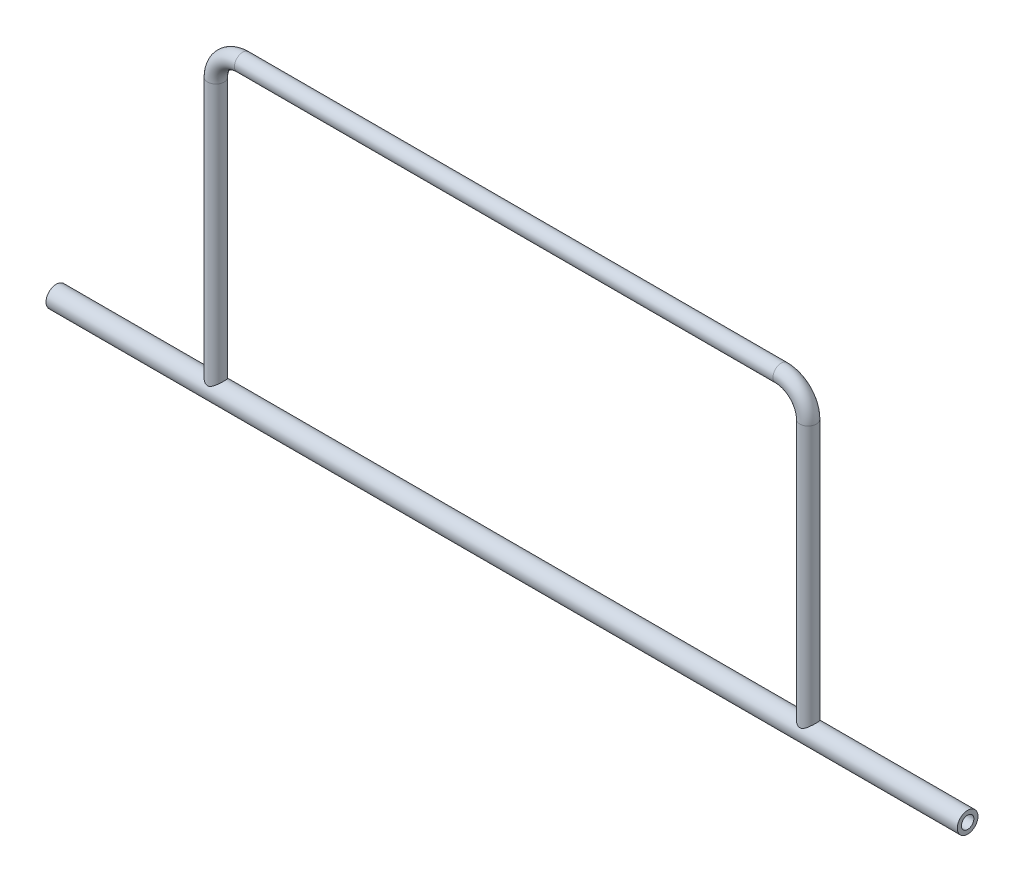
ISO-10303-21;
HEADER;
FILE_DESCRIPTION(('STEP AP214'),'2;1');
FILE_NAME('part.step','',(''),(''),'','','');
FILE_SCHEMA(('AUTOMOTIVE_DESIGN { 1 0 10303 214 1 1 1 1 }'));
ENDSEC;
DATA;
#1=APPLICATION_CONTEXT('core data for automotive mechanical design processes');
#2=APPLICATION_PROTOCOL_DEFINITION('international standard','automotive_design',2000,#1);
#3=PRODUCT_CONTEXT('',#1,'mechanical');
#4=PRODUCT('Part','Part','',(#3));
#5=PRODUCT_RELATED_PRODUCT_CATEGORY('part','',(#4));
#6=PRODUCT_DEFINITION_FORMATION('','',#4);
#7=PRODUCT_DEFINITION_CONTEXT('part definition',#1,'design');
#8=PRODUCT_DEFINITION('design','',#6,#7);
#9=PRODUCT_DEFINITION_SHAPE('','',#8);
#10=(LENGTH_UNIT() NAMED_UNIT(*) SI_UNIT(.MILLI.,.METRE.));
#11=(NAMED_UNIT(*) PLANE_ANGLE_UNIT() SI_UNIT($,.RADIAN.));
#12=(NAMED_UNIT(*) SI_UNIT($,.STERADIAN.) SOLID_ANGLE_UNIT());
#13=UNCERTAINTY_MEASURE_WITH_UNIT(LENGTH_MEASURE(1.E-05),#10,'distance_accuracy_value','');
#14=(GEOMETRIC_REPRESENTATION_CONTEXT(3) GLOBAL_UNCERTAINTY_ASSIGNED_CONTEXT((#13)) GLOBAL_UNIT_ASSIGNED_CONTEXT((#10,
#11,#12)) REPRESENTATION_CONTEXT('',''));
#15=CARTESIAN_POINT('',(0.,0.,0.));
#16=DIRECTION('',(0.,0.,1.));
#17=DIRECTION('',(1.,0.,0.));
#18=AXIS2_PLACEMENT_3D('',#15,#16,#17);
#19=CARTESIAN_POINT('',(-220.,0.,0.));
#20=DIRECTION('',(1.,0.,0.));
#21=DIRECTION('',(0.,0.,-1.));
#22=AXIS2_PLACEMENT_3D('',#19,#20,#21);
#23=CYLINDRICAL_SURFACE('',#22,5.);
#24=CARTESIAN_POINT('',(220.,0.,0.));
#25=DIRECTION('',(1.,0.,0.));
#26=DIRECTION('',(0.,0.,-1.));
#27=AXIS2_PLACEMENT_3D('',#24,#25,#26);
#28=CIRCLE('',#27,5.);
#29=CARTESIAN_POINT('',(220.,0.,-5.));
#30=VERTEX_POINT('',#29);
#31=EDGE_CURVE('E117',#30,#30,#28,.T.);
#32=ORIENTED_EDGE('',*,*,#31,.F.);
#33=EDGE_LOOP('',(#32));
#34=FACE_BOUND('',#33,.T.);
#35=CARTESIAN_POINT('',(-143.,3.,4.));
#36=CARTESIAN_POINT('',(-143.075112763872,3.00000216897706,3.99999906153736));
#37=CARTESIAN_POINT('',(-143.150254878305,3.0028377209995,3.9978772461753));
#38=CARTESIAN_POINT('',(-143.299908566862,3.01402583978567,3.9894472679785));
#39=CARTESIAN_POINT('',(-143.374419675909,3.02238216858029,3.98313625047582));
#40=CARTESIAN_POINT('',(-143.596479266939,3.05522921920832,3.95807727295162));
#41=CARTESIAN_POINT('',(-143.742244109025,3.0874955182953,3.93320424396427));
#42=CARTESIAN_POINT('',(-144.075267929606,3.18155216304267,3.85777127536566));
#43=CARTESIAN_POINT('',(-144.259280762929,3.24971322017134,3.80127986277753));
#44=CARTESIAN_POINT('',(-144.611940543659,3.40189644530756,3.66572012951489));
#45=CARTESIAN_POINT('',(-144.78054239204,3.48596308623153,3.58658817896458));
#46=CARTESIAN_POINT('',(-145.051102580511,3.63299455510024,3.4363727853443));
#47=CARTESIAN_POINT('',(-145.157172572942,3.694143683478,3.37076459378185));
#48=CARTESIAN_POINT('',(-145.362360914869,3.81759266309351,3.23028207033377));
#49=CARTESIAN_POINT('',(-145.461476749144,3.87989292049062,3.15540441260615));
#50=CARTESIAN_POINT('',(-145.652469855169,4.00378958470974,2.99663184861431));
#51=CARTESIAN_POINT('',(-145.744354519094,4.06538665380559,2.91274636380753));
#52=CARTESIAN_POINT('',(-145.920613018511,4.18639237889891,2.73598294461539));
#53=CARTESIAN_POINT('',(-146.00498586031,4.24580074475848,2.64310382389852));
#54=CARTESIAN_POINT('',(-146.214164134542,4.39576497816679,2.38958702931891));
#55=CARTESIAN_POINT('',(-146.332640399593,4.48348070331292,2.22188522507705));
#56=CARTESIAN_POINT('',(-146.54474406666,4.64331594269541,1.86487183658861));
#57=CARTESIAN_POINT('',(-146.638410083669,4.71545966061737,1.67559449748562));
#58=CARTESIAN_POINT('',(-146.783423416902,4.82831023596969,1.31063780833639));
#59=CARTESIAN_POINT('',(-146.839164458238,4.87221400973622,1.13770814774396));
#60=CARTESIAN_POINT('',(-146.926998061055,4.94171895740111,0.78237513014681));
#61=CARTESIAN_POINT('',(-146.959103555756,4.96733014065903,0.599977012805112));
#62=CARTESIAN_POINT('',(-146.997716006024,4.99815918603462,0.230096932996524));
#63=CARTESIAN_POINT('',(-147.004134337086,5.00330644418758,0.0425996130134163));
#64=CARTESIAN_POINT('',(-146.990671578549,4.99253877415278,-0.330832803126801));
#65=CARTESIAN_POINT('',(-146.970789271868,4.97662287125135,-0.516767826586752));
#66=CARTESIAN_POINT('',(-146.907864015456,4.92656730161909,-0.871367119528885));
#67=CARTESIAN_POINT('',(-146.866142362886,4.89346809374314,-1.04042037317328));
#68=CARTESIAN_POINT('',(-146.762609534698,4.81208987661317,-1.3683437290071));
#69=CARTESIAN_POINT('',(-146.700793289892,4.76380703714183,-1.52721124956011));
#70=CARTESIAN_POINT('',(-146.552798601851,4.6497244388944,-1.84705463504237));
#71=CARTESIAN_POINT('',(-146.464846967744,4.582685312925,-2.00675938549038));
#72=CARTESIAN_POINT('',(-146.270924281044,4.43788087321012,-2.30941782762206));
#73=CARTESIAN_POINT('',(-146.164943141211,4.36010955958914,-2.45236206600431));
#74=CARTESIAN_POINT('',(-145.913876262479,4.18107021951003,-2.74853042703121));
#75=CARTESIAN_POINT('',(-145.765232772259,4.07826288579635,-2.89780217491636));
#76=CARTESIAN_POINT('',(-145.44748819203,3.8698475585256,-3.17076769972647));
#77=CARTESIAN_POINT('',(-145.27836224005,3.76423628533181,-3.29442988804259));
#78=CARTESIAN_POINT('',(-144.937559610716,3.56882635257452,-3.50457057042853));
#79=CARTESIAN_POINT('',(-144.767698127378,3.47848449125888,-3.59348348213152));
#80=CARTESIAN_POINT('',(-144.411267058945,3.311642115282,-3.74778213755155));
#81=CARTESIAN_POINT('',(-144.224735128158,3.23511152965086,-3.81321930924473));
#82=CARTESIAN_POINT('',(-143.894416813681,3.12787610334288,-3.9012440004466));
#83=CARTESIAN_POINT('',(-143.754774407918,3.09031204063763,-3.93080589266452));
#84=CARTESIAN_POINT('',(-143.469639518534,3.03334609209688,-3.97493954411983));
#85=CARTESIAN_POINT('',(-143.324160835899,3.01390372218814,-3.98954472407251));
#86=CARTESIAN_POINT('',(-143.030273501902,2.99655581152985,-4.00259995644497));
#87=CARTESIAN_POINT('',(-142.881852793524,2.99877509004065,-4.00095637919488));
#88=CARTESIAN_POINT('',(-142.587904384925,3.0246091025562,-3.98145195095297));
#89=CARTESIAN_POINT('',(-142.442381062989,3.04825402601149,-3.96356821696024));
#90=CARTESIAN_POINT('',(-142.121878115775,3.12103026774742,-3.90662980025043));
#91=CARTESIAN_POINT('',(-141.94882232993,3.1751148433933,-3.863346828879));
#92=CARTESIAN_POINT('',(-141.615399345019,3.30045577188713,-3.75682278303048));
#93=CARTESIAN_POINT('',(-141.455071781662,3.37176316858112,-3.69352220593003));
#94=CARTESIAN_POINT('',(-141.189074477891,3.50285579501051,-3.56873529200271));
#95=CARTESIAN_POINT('',(-141.080354696356,3.56053707787217,-3.51139365352878));
#96=CARTESIAN_POINT('',(-140.869582620207,3.67845509899158,-3.38766369294496));
#97=CARTESIAN_POINT('',(-140.767533088952,3.7386928795264,-3.32127165613198));
#98=CARTESIAN_POINT('',(-140.570043881248,3.85987201944703,-3.17963685728907));
#99=CARTESIAN_POINT('',(-140.474610822119,3.92081401406671,-3.10438543197552));
#100=CARTESIAN_POINT('',(-140.2906527842,4.04175247615811,-2.94520421443705));
#101=CARTESIAN_POINT('',(-140.202126727445,4.10174909000277,-2.86127578119152));
#102=CARTESIAN_POINT('',(-140.031149060477,4.22021627080505,-2.68353213742294));
#103=CARTESIAN_POINT('',(-139.948802776614,4.27865261127789,-2.58959239644204));
#104=CARTESIAN_POINT('',(-139.792257205107,4.39166054074386,-2.39294409088252));
#105=CARTESIAN_POINT('',(-139.718059192468,4.44623152443024,-2.29023415844015));
#106=CARTESIAN_POINT('',(-139.578894979503,4.54992450745381,-2.07659269983663));
#107=CARTESIAN_POINT('',(-139.513903972703,4.59906106720033,-1.96568453999986));
#108=CARTESIAN_POINT('',(-139.394017175426,4.6905881423898,-1.73599312724418));
#109=CARTESIAN_POINT('',(-139.339115669097,4.73298247555987,-1.61721438534427));
#110=CARTESIAN_POINT('',(-139.223065833842,4.82322056507459,-1.32913962146255));
#111=CARTESIAN_POINT('',(-139.166577838741,4.86768700006944,-1.15683679137337));
#112=CARTESIAN_POINT('',(-139.077123147012,4.93844243001733,-0.8027105168352));
#113=CARTESIAN_POINT('',(-139.044138494829,4.96474530068644,-0.620894454329545));
#114=CARTESIAN_POINT('',(-139.003617740141,4.99709091896648,-0.251928169863176));
#115=CARTESIAN_POINT('',(-138.996174493275,5.00305974169112,-0.064760973992973));
#116=CARTESIAN_POINT('',(-139.007532115076,4.99397521901684,0.308260451752421));
#117=CARTESIAN_POINT('',(-139.026334831698,4.97892039336181,0.494114588250236));
#118=CARTESIAN_POINT('',(-139.08720730726,4.93047997807309,0.848969594728834));
#119=CARTESIAN_POINT('',(-139.127978682933,4.89811800019638,1.01834018003767));
#120=CARTESIAN_POINT('',(-139.229706822495,4.81810404518645,1.34704122291862));
#121=CARTESIAN_POINT('',(-139.290668814301,4.77044810811757,1.50636906741204));
#122=CARTESIAN_POINT('',(-139.436748943794,4.65772424604642,1.8267669860776));
#123=CARTESIAN_POINT('',(-139.523587053218,4.59144870858765,1.98661951413855));
#124=CARTESIAN_POINT('',(-139.715285305531,4.44806715123529,2.28972858505144));
#125=CARTESIAN_POINT('',(-139.820155017026,4.37095538500456,2.43297624848932));
#126=CARTESIAN_POINT('',(-140.068589557793,4.19334053560391,2.72976152486732));
#127=CARTESIAN_POINT('',(-140.215681095874,4.09128024292154,2.87940400752529));
#128=CARTESIAN_POINT('',(-140.530245595292,3.88401197785617,3.15339914395298));
#129=CARTESIAN_POINT('',(-140.697743788482,3.77880023252427,3.27771997097513));
#130=CARTESIAN_POINT('',(-140.956465363112,3.62927982065265,3.43993958125248));
#131=CARTESIAN_POINT('',(-141.040019970102,3.58277064491089,3.48824759185102));
#132=CARTESIAN_POINT('',(-141.211352590074,3.49198784457613,3.57912761543909));
#133=CARTESIAN_POINT('',(-141.299131165734,3.44771451944072,3.62169886134501));
#134=CARTESIAN_POINT('',(-141.56867868407,3.32016981870035,3.74029659813687));
#135=CARTESIAN_POINT('',(-141.757075167135,3.24192092894642,3.80747088284748));
#136=CARTESIAN_POINT('',(-142.092338061681,3.13160451168611,3.89828691275498));
#137=CARTESIAN_POINT('',(-142.23498946695,3.09272315846935,3.92892882070588));
#138=CARTESIAN_POINT('',(-142.453408326191,3.04855095693215,3.96316402261263));
#139=CARTESIAN_POINT('',(-142.52685989967,3.03619187391989,3.97261660358216));
#140=CARTESIAN_POINT('',(-142.674838471096,3.01668227593598,3.98745340408319));
#141=CARTESIAN_POINT('',(-142.749364678678,3.00952811408349,3.99284047225642));
#142=CARTESIAN_POINT('',(-142.853381820678,3.00343793345697,3.99741959341137));
#143=CARTESIAN_POINT('',(-142.882678806619,3.00215019354812,3.99838660813179));
#144=CARTESIAN_POINT('',(-142.941315698446,3.00043074741308,3.99967703663994));
#145=CARTESIAN_POINT('',(-142.970655609424,2.99999915264321,4.00000036663029));
#146=CARTESIAN_POINT('',(-143.,3.,4.));
#147=B_SPLINE_CURVE_WITH_KNOTS('',3,(#35,#36,#37,#38,#39,#40,#41,#42,#43,#44,#45,#46,#47,#48,
#49,#50,#51,#52,#53,#54,#55,#56,#57,#58,#59,#60,#61,#62,#63,#64,#65,#66,#67,#68,#69,#70,#71,#72,
#73,#74,#75,#76,#77,#78,#79,#80,#81,#82,#83,#84,#85,#86,#87,#88,#89,#90,#91,#92,#93,#94,#95,#96,
#97,#98,#99,#100,#101,#102,#103,#104,#105,#106,#107,#108,#109,#110,#111,#112,#113,#114,#115,
#116,#117,#118,#119,#120,#121,#122,#123,#124,#125,#126,#127,#128,#129,#130,#131,#132,#133,#134,
#135,#136,#137,#138,#139,#140,#141,#142,#143,#144,#145,#146),.UNSPECIFIED.,.T.,.F.,(4,2,2,2,2,2,
2,2,2,2,2,2,2,2,2,2,2,2,2,2,2,2,2,2,2,2,2,2,2,2,2,2,2,2,2,2,2,2,2,2,2,2,2,2,2,2,2,2,2,2,2,2,2,2,
2,4),(0.,0.225303149807227,0.45075998683823,0.902589537001534,1.51190711853315,2.12295426111055,
2.53921883623533,2.95563320042539,3.37161619465104,3.78765413525728,4.45477512810168,
5.12085162154029,5.67923095322339,6.23730451573864,6.79730186307843,7.35732512562408,
7.88682741454584,8.4164633828124,8.99711927828842,9.57810111704289,10.2788135954479,
10.9803852999411,11.6143729322192,12.2469630912607,12.6881435902171,13.1283361077291,
13.5710666035102,14.0144218930567,14.5705602720658,15.1283675704705,15.5352238321968,
15.9422475922461,16.3496727250839,16.7570341440245,17.1702378198689,17.5835060601355,
17.9956387441516,18.4075372242806,18.9651425713466,19.5223214735685,20.0815238628588,
20.6407656270704,21.1700928587456,21.6995572553744,22.2782911959238,22.8573331992423,
23.5548944002192,24.2533270266165,24.5745079263912,24.8957317299052,25.5365329660935,
25.9876445768306,26.2126360623764,26.4374697531347,26.5254777394983,26.6134971823349),.UNSPECIFIED.);
#148=CARTESIAN_POINT('',(-143.,3.,4.));
#149=VERTEX_POINT('',#148);
#150=EDGE_CURVE('E75',#149,#149,#147,.T.);
#151=ORIENTED_EDGE('',*,*,#150,.T.);
#152=EDGE_LOOP('',(#151));
#153=FACE_BOUND('',#152,.T.);
#154=CARTESIAN_POINT('',(-220.,0.,0.));
#155=DIRECTION('',(1.,0.,0.));
#156=DIRECTION('',(0.,0.,-1.));
#157=AXIS2_PLACEMENT_3D('',#154,#155,#156);
#158=CIRCLE('',#157,5.);
#159=CARTESIAN_POINT('',(-220.,0.,-5.));
#160=VERTEX_POINT('',#159);
#161=EDGE_CURVE('E11',#160,#160,#158,.T.);
#162=ORIENTED_EDGE('',*,*,#161,.T.);
#163=EDGE_LOOP('',(#162));
#164=FACE_BOUND('',#163,.T.);
#165=CARTESIAN_POINT('',(143.,3.,4.));
#166=CARTESIAN_POINT('',(142.924887236128,3.00000216897706,3.99999906153736));
#167=CARTESIAN_POINT('',(142.849745121695,3.0028377209995,3.9978772461753));
#168=CARTESIAN_POINT('',(142.700091433138,3.01402583978567,3.9894472679785));
#169=CARTESIAN_POINT('',(142.625580324091,3.02238216858029,3.98313625047582));
#170=CARTESIAN_POINT('',(142.403520733061,3.05522921920832,3.95807727295162));
#171=CARTESIAN_POINT('',(142.257755890975,3.0874955182953,3.93320424396427));
#172=CARTESIAN_POINT('',(141.924732070394,3.18155216304267,3.85777127536566));
#173=CARTESIAN_POINT('',(141.740719237071,3.24971322017134,3.80127986277753));
#174=CARTESIAN_POINT('',(141.388059456341,3.40189644530756,3.66572012951489));
#175=CARTESIAN_POINT('',(141.21945760796,3.48596308623153,3.58658817896458));
#176=CARTESIAN_POINT('',(140.948897419489,3.63299455510026,3.43637278534428));
#177=CARTESIAN_POINT('',(140.842827427058,3.69414368347802,3.37076459378183));
#178=CARTESIAN_POINT('',(140.637639085131,3.81759266309354,3.23028207033374));
#179=CARTESIAN_POINT('',(140.538523250856,3.87989292049064,3.15540441260614));
#180=CARTESIAN_POINT('',(140.347530144831,4.00378958470974,2.99663184861431));
#181=CARTESIAN_POINT('',(140.255645480906,4.06538665380559,2.91274636380754));
#182=CARTESIAN_POINT('',(140.079386981489,4.18639237889891,2.7359829446154));
#183=CARTESIAN_POINT('',(139.99501413969,4.24580074475848,2.64310382389852));
#184=CARTESIAN_POINT('',(139.785835865458,4.39576497816679,2.3895870293189));
#185=CARTESIAN_POINT('',(139.667359600407,4.48348070331292,2.22188522507705));
#186=CARTESIAN_POINT('',(139.45525593334,4.64331594269541,1.86487183658861));
#187=CARTESIAN_POINT('',(139.361589916331,4.71545966061737,1.67559449748562));
#188=CARTESIAN_POINT('',(139.216576583098,4.82831023596969,1.31063780833639));
#189=CARTESIAN_POINT('',(139.160835541762,4.87221400973622,1.13770814774396));
#190=CARTESIAN_POINT('',(139.073001938945,4.94171895740111,0.78237513014681));
#191=CARTESIAN_POINT('',(139.040896444244,4.96733014065903,0.599977012805112));
#192=CARTESIAN_POINT('',(139.002283993976,4.99815918603462,0.230096932996524));
#193=CARTESIAN_POINT('',(138.995865662914,5.00330644418758,0.0425996130134156));
#194=CARTESIAN_POINT('',(139.009328421451,4.99253877415278,-0.330832803126801));
#195=CARTESIAN_POINT('',(139.029210728132,4.97662287125135,-0.516767826586753));
#196=CARTESIAN_POINT('',(139.092135984544,4.92656730161909,-0.871367119528885));
#197=CARTESIAN_POINT('',(139.133857637114,4.89346809374314,-1.04042037317328));
#198=CARTESIAN_POINT('',(139.237390465302,4.81208987661317,-1.3683437290071));
#199=CARTESIAN_POINT('',(139.299206710108,4.76380703714183,-1.52721124956011));
#200=CARTESIAN_POINT('',(139.447201398149,4.6497244388944,-1.84705463504237));
#201=CARTESIAN_POINT('',(139.535153032257,4.582685312925,-2.00675938549038));
#202=CARTESIAN_POINT('',(139.729075718956,4.43788087321012,-2.30941782762206));
#203=CARTESIAN_POINT('',(139.835056858789,4.36010955958914,-2.45236206600431));
#204=CARTESIAN_POINT('',(140.086123737521,4.18107021951003,-2.74853042703121));
#205=CARTESIAN_POINT('',(140.234767227741,4.07826288579635,-2.89780217491636));
#206=CARTESIAN_POINT('',(140.55251180797,3.8698475585256,-3.17076769972647));
#207=CARTESIAN_POINT('',(140.72163775995,3.76423628533181,-3.29442988804259));
#208=CARTESIAN_POINT('',(141.062440389284,3.56882635257452,-3.50457057042853));
#209=CARTESIAN_POINT('',(141.232301872622,3.47848449125888,-3.59348348213152));
#210=CARTESIAN_POINT('',(141.588732941055,3.311642115282,-3.74778213755155));
#211=CARTESIAN_POINT('',(141.775264871842,3.23511152965086,-3.81321930924473));
#212=CARTESIAN_POINT('',(142.105583186319,3.12787610334288,-3.9012440004466));
#213=CARTESIAN_POINT('',(142.245225592082,3.09031204063763,-3.93080589266452));
#214=CARTESIAN_POINT('',(142.530360481466,3.03334609209688,-3.97493954411983));
#215=CARTESIAN_POINT('',(142.675839164101,3.01390372218814,-3.98954472407251));
#216=CARTESIAN_POINT('',(142.969726498098,2.99655581152985,-4.00259995644497));
#217=CARTESIAN_POINT('',(143.118147206476,2.99877509004065,-4.00095637919488));
#218=CARTESIAN_POINT('',(143.412095615075,3.0246091025562,-3.98145195095297));
#219=CARTESIAN_POINT('',(143.557618937011,3.04825402601149,-3.96356821696024));
#220=CARTESIAN_POINT('',(143.878121884225,3.12103026774742,-3.90662980025043));
#221=CARTESIAN_POINT('',(144.05117767007,3.1751148433933,-3.863346828879));
#222=CARTESIAN_POINT('',(144.384600654981,3.30045577188713,-3.75682278303048));
#223=CARTESIAN_POINT('',(144.544928218338,3.37176316858112,-3.69352220593003));
#224=CARTESIAN_POINT('',(144.810925522109,3.50285579501052,-3.56873529200271));
#225=CARTESIAN_POINT('',(144.919645303644,3.56053707787218,-3.51139365352877));
#226=CARTESIAN_POINT('',(145.130417379793,3.6784550989916,-3.38766369294494));
#227=CARTESIAN_POINT('',(145.232466911048,3.73869287952641,-3.32127165613197));
#228=CARTESIAN_POINT('',(145.429956118752,3.85987201944704,-3.17963685728906));
#229=CARTESIAN_POINT('',(145.525389177881,3.92081401406672,-3.10438543197552));
#230=CARTESIAN_POINT('',(145.7093472158,4.04175247615812,-2.94520421443705));
#231=CARTESIAN_POINT('',(145.797873272555,4.10174909000277,-2.86127578119152));
#232=CARTESIAN_POINT('',(145.968850939523,4.22021627080505,-2.68353213742294));
#233=CARTESIAN_POINT('',(146.051197223386,4.27865261127789,-2.58959239644204));
#234=CARTESIAN_POINT('',(146.207742794893,4.39166054074386,-2.39294409088252));
#235=CARTESIAN_POINT('',(146.281940807532,4.44623152443024,-2.29023415844015));
#236=CARTESIAN_POINT('',(146.421105020497,4.54992450745381,-2.07659269983662));
#237=CARTESIAN_POINT('',(146.486096027297,4.59906106720033,-1.96568453999986));
#238=CARTESIAN_POINT('',(146.605982824574,4.6905881423898,-1.73599312724418));
#239=CARTESIAN_POINT('',(146.660884330903,4.73298247555987,-1.61721438534427));
#240=CARTESIAN_POINT('',(146.776934166158,4.82322056507459,-1.32913962146255));
#241=CARTESIAN_POINT('',(146.833422161259,4.86768700006944,-1.15683679137337));
#242=CARTESIAN_POINT('',(146.922876852988,4.93844243001733,-0.8027105168352));
#243=CARTESIAN_POINT('',(146.955861505171,4.96474530068644,-0.620894454329545));
#244=CARTESIAN_POINT('',(146.996382259859,4.99709091896648,-0.251928169863176));
#245=CARTESIAN_POINT('',(147.003825506725,5.00305974169112,-0.064760973992973));
#246=CARTESIAN_POINT('',(146.992467884924,4.99397521901684,0.308260451752421));
#247=CARTESIAN_POINT('',(146.973665168302,4.97892039336181,0.494114588250236));
#248=CARTESIAN_POINT('',(146.91279269274,4.93047997807309,0.848969594728834));
#249=CARTESIAN_POINT('',(146.872021317067,4.89811800019638,1.01834018003767));
#250=CARTESIAN_POINT('',(146.770293177505,4.81810404518645,1.34704122291862));
#251=CARTESIAN_POINT('',(146.709331185699,4.77044810811757,1.50636906741204));
#252=CARTESIAN_POINT('',(146.563251056206,4.65772424604642,1.8267669860776));
#253=CARTESIAN_POINT('',(146.476412946782,4.59144870858765,1.98661951413855));
#254=CARTESIAN_POINT('',(146.284714694469,4.44806715123529,2.28972858505144));
#255=CARTESIAN_POINT('',(146.179844982974,4.37095538500456,2.43297624848932));
#256=CARTESIAN_POINT('',(145.931410442207,4.19334053560392,2.72976152486731));
#257=CARTESIAN_POINT('',(145.784318904126,4.09128024292155,2.87940400752528));
#258=CARTESIAN_POINT('',(145.469754404708,3.88401197785618,3.15339914395297));
#259=CARTESIAN_POINT('',(145.302256211518,3.77880023252427,3.27771997097513));
#260=CARTESIAN_POINT('',(145.043534636888,3.62927982065265,3.43993958125248));
#261=CARTESIAN_POINT('',(144.959980029899,3.58277064491088,3.48824759185103));
#262=CARTESIAN_POINT('',(144.788647409926,3.49198784457612,3.57912761543911));
#263=CARTESIAN_POINT('',(144.700868834266,3.44771451944071,3.62169886134502));
#264=CARTESIAN_POINT('',(144.43132131593,3.32016981870035,3.74029659813687));
#265=CARTESIAN_POINT('',(144.242924832865,3.24192092894642,3.80747088284748));
#266=CARTESIAN_POINT('',(143.907661938319,3.13160451168611,3.89828691275498));
#267=CARTESIAN_POINT('',(143.76501053305,3.09272315846935,3.92892882070588));
#268=CARTESIAN_POINT('',(143.546591673809,3.04855095693215,3.96316402261263));
#269=CARTESIAN_POINT('',(143.47314010033,3.03619187391989,3.97261660358217));
#270=CARTESIAN_POINT('',(143.325161528904,3.01668227593598,3.98745340408319));
#271=CARTESIAN_POINT('',(143.250635321322,3.00952811408348,3.99284047225643));
#272=CARTESIAN_POINT('',(143.146618179322,3.00343793345697,3.99741959341137));
#273=CARTESIAN_POINT('',(143.117321193381,3.00215019354812,3.99838660813179));
#274=CARTESIAN_POINT('',(143.058684301554,3.00043074741308,3.99967703663994));
#275=CARTESIAN_POINT('',(143.029344390576,2.99999915264321,4.00000036663029));
#276=CARTESIAN_POINT('',(143.,3.,4.));
#277=B_SPLINE_CURVE_WITH_KNOTS('',3,(#165,#166,#167,#168,#169,#170,#171,#172,#173,#174,#175,
#176,#177,#178,#179,#180,#181,#182,#183,#184,#185,#186,#187,#188,#189,#190,#191,#192,#193,#194,
#195,#196,#197,#198,#199,#200,#201,#202,#203,#204,#205,#206,#207,#208,#209,#210,#211,#212,#213,
#214,#215,#216,#217,#218,#219,#220,#221,#222,#223,#224,#225,#226,#227,#228,#229,#230,#231,#232,
#233,#234,#235,#236,#237,#238,#239,#240,#241,#242,#243,#244,#245,#246,#247,#248,#249,#250,#251,
#252,#253,#254,#255,#256,#257,#258,#259,#260,#261,#262,#263,#264,#265,#266,#267,#268,#269,#270,
#271,#272,#273,#274,#275,#276),.UNSPECIFIED.,.T.,.F.,(4,2,2,2,2,2,2,2,2,2,2,2,2,2,2,2,2,2,2,2,2,
2,2,2,2,2,2,2,2,2,2,2,2,2,2,2,2,2,2,2,2,2,2,2,2,2,2,2,2,2,2,2,2,2,2,4),(0.,0.225303149807227,
0.45075998683823,0.902589537001534,1.51190711853315,2.12295426111055,2.53921883623543,
2.95563320042539,3.37161619465103,3.78765413525728,4.45477512810168,5.12085162154029,
5.67923095322339,6.23730451573864,6.79730186307844,7.35732512562408,7.88682741454584,
8.4164633828124,8.99711927828842,9.57810111704289,10.2788135954479,10.9803852999411,
11.6143729322192,12.2469630912607,12.6881435902171,13.1283361077291,13.5710666035102,
14.0144218930567,14.5705602720658,15.1283675704705,15.5352238321968,15.9422475922461,
16.3496727250839,16.7570341440245,17.1702378198689,17.5835060601355,17.9956387441516,
18.4075372242806,18.9651425713466,19.5223214735685,20.0815238628588,20.6407656270703,
21.1700928587456,21.6995572553744,22.2782911959238,22.8573331992423,23.5548944002192,
24.2533270266165,24.5745079263912,24.8957317299052,25.5365329660934,25.9876445768306,
26.2126360623765,26.4374697531347,26.5254777394983,26.6134971823349),.UNSPECIFIED.);
#278=CARTESIAN_POINT('',(143.,3.,4.));
#279=VERTEX_POINT('',#278);
#280=EDGE_CURVE('E67',#279,#279,#277,.T.);
#281=ORIENTED_EDGE('',*,*,#280,.T.);
#282=EDGE_LOOP('',(#281));
#283=FACE_BOUND('',#282,.T.);
#284=ADVANCED_FACE('F63',(#34,#153,#164,#283),#23,.T.);
#285=CARTESIAN_POINT('',(-220.,0.,0.));
#286=DIRECTION('',(1.,0.,0.));
#287=DIRECTION('',(0.,0.,-1.));
#288=AXIS2_PLACEMENT_3D('',#285,#286,#287);
#289=PLANE('',#288);
#290=CARTESIAN_POINT('',(-220.,0.,0.));
#291=DIRECTION('',(1.,0.,0.));
#292=DIRECTION('',(0.,0.,-1.));
#293=AXIS2_PLACEMENT_3D('',#290,#291,#292);
#294=CIRCLE('',#293,3.);
#295=CARTESIAN_POINT('',(-220.,0.,-3.));
#296=VERTEX_POINT('',#295);
#297=EDGE_CURVE('E114',#296,#296,#294,.F.);
#298=ORIENTED_EDGE('',*,*,#297,.F.);
#299=EDGE_LOOP('',(#298));
#300=FACE_BOUND('',#299,.T.);
#301=ORIENTED_EDGE('',*,*,#161,.F.);
#302=EDGE_LOOP('',(#301));
#303=FACE_BOUND('',#302,.T.);
#304=ADVANCED_FACE('F93',(#300,#303),#289,.F.);
#305=CARTESIAN_POINT('',(-143.,0.,0.));
#306=DIRECTION('',(0.,1.,0.));
#307=DIRECTION('',(0.,0.,1.));
#308=AXIS2_PLACEMENT_3D('',#305,#306,#307);
#309=CYLINDRICAL_SURFACE('',#308,4.);
#310=ORIENTED_EDGE('',*,*,#150,.F.);
#311=EDGE_LOOP('',(#310));
#312=FACE_BOUND('',#311,.T.);
#313=CARTESIAN_POINT('',(-143.,130.,0.));
#314=DIRECTION('',(0.,-1.,0.));
#315=DIRECTION('',(0.,0.,1.));
#316=AXIS2_PLACEMENT_3D('',#313,#314,#315);
#317=CIRCLE('',#316,4.);
#318=CARTESIAN_POINT('',(-147.,130.,0.));
#319=VERTEX_POINT('',#318);
#320=EDGE_CURVE('E116',#319,#319,#317,.T.);
#321=ORIENTED_EDGE('',*,*,#320,.T.);
#322=EDGE_LOOP('',(#321));
#323=FACE_BOUND('',#322,.T.);
#324=ADVANCED_FACE('F87',(#312,#323),#309,.T.);
#325=CARTESIAN_POINT('',(-130.,130.,0.));
#326=DIRECTION('',(0.,0.,-1.));
#327=DIRECTION('',(-1.,0.,0.));
#328=AXIS2_PLACEMENT_3D('',#325,#326,#327);
#329=TOROIDAL_SURFACE('',#328,13.,4.);
#330=CARTESIAN_POINT('',(-130.,143.,0.));
#331=DIRECTION('',(-1.,0.,0.));
#332=DIRECTION('',(0.,0.,1.));
#333=AXIS2_PLACEMENT_3D('',#330,#331,#332);
#334=CIRCLE('',#333,4.);
#335=CARTESIAN_POINT('',(-130.,147.,0.));
#336=VERTEX_POINT('',#335);
#337=EDGE_CURVE('E80',#336,#336,#334,.T.);
#338=CARTESIAN_POINT('',(-130.,130.,0.));
#339=DIRECTION('',(0.,0.,-1.));
#340=DIRECTION('',(-1.,0.,0.));
#341=AXIS2_PLACEMENT_3D('',#338,#339,#340);
#342=CIRCLE('',#341,17.);
#343=EDGE_CURVE('',#319,#336,#342,.T.);
#344=ORIENTED_EDGE('',*,*,#320,.F.);
#345=ORIENTED_EDGE('',*,*,#337,.T.);
#346=ORIENTED_EDGE('',*,*,#343,.T.);
#347=ORIENTED_EDGE('',*,*,#343,.F.);
#348=EDGE_LOOP('',(#344,#346,#345,#347));
#349=FACE_BOUND('',#348,.T.);
#350=ADVANCED_FACE('F92',(#349),#329,.T.);
#351=CARTESIAN_POINT('',(-130.,143.,0.));
#352=DIRECTION('',(1.,0.,0.));
#353=DIRECTION('',(0.,0.,-1.));
#354=AXIS2_PLACEMENT_3D('',#351,#352,#353);
#355=CYLINDRICAL_SURFACE('',#354,4.);
#356=ORIENTED_EDGE('',*,*,#337,.F.);
#357=EDGE_LOOP('',(#356));
#358=FACE_BOUND('',#357,.T.);
#359=CARTESIAN_POINT('',(130.,143.,0.));
#360=DIRECTION('',(-1.,0.,0.));
#361=DIRECTION('',(0.,0.,1.));
#362=AXIS2_PLACEMENT_3D('',#359,#360,#361);
#363=CIRCLE('',#362,4.);
#364=CARTESIAN_POINT('',(130.,147.,0.));
#365=VERTEX_POINT('',#364);
#366=EDGE_CURVE('E123',#365,#365,#363,.F.);
#367=ORIENTED_EDGE('',*,*,#366,.F.);
#368=EDGE_LOOP('',(#367));
#369=FACE_BOUND('',#368,.T.);
#370=ADVANCED_FACE('F99',(#358,#369),#355,.T.);
#371=CARTESIAN_POINT('',(-228.485281374239,0.,0.));
#372=DIRECTION('',(1.,0.,0.));
#373=DIRECTION('',(0.,0.,-1.));
#374=AXIS2_PLACEMENT_3D('',#371,#372,#373);
#375=CYLINDRICAL_SURFACE('',#374,3.);
#376=CARTESIAN_POINT('',(220.,0.,0.));
#377=DIRECTION('',(-1.,0.,0.));
#378=DIRECTION('',(0.,0.,1.));
#379=AXIS2_PLACEMENT_3D('',#376,#377,#378);
#380=CIRCLE('',#379,3.);
#381=CARTESIAN_POINT('',(220.,0.,-3.));
#382=VERTEX_POINT('',#381);
#383=EDGE_CURVE('E129',#382,#382,#380,.T.);
#384=CARTESIAN_POINT('',(-220.,0.,-3.));
#385=CARTESIAN_POINT('',(-215.416666666667,0.,-3.));
#386=CARTESIAN_POINT('',(-210.833333333333,0.,-3.));
#387=CARTESIAN_POINT('',(-201.666666666667,0.,-3.));
#388=CARTESIAN_POINT('',(-197.083333333333,0.,-3.));
#389=CARTESIAN_POINT('',(-187.916666666667,0.,-3.));
#390=CARTESIAN_POINT('',(-183.333333333333,0.,-3.));
#391=CARTESIAN_POINT('',(-174.166666666667,0.,-3.));
#392=CARTESIAN_POINT('',(-169.583333333333,0.,-3.));
#393=CARTESIAN_POINT('',(-160.416666666667,0.,-3.));
#394=CARTESIAN_POINT('',(-155.833333333333,0.,-3.));
#395=CARTESIAN_POINT('',(-146.666666666667,0.,-3.));
#396=CARTESIAN_POINT('',(-142.083333333333,0.,-3.));
#397=CARTESIAN_POINT('',(-132.916666666667,0.,-3.));
#398=CARTESIAN_POINT('',(-128.333333333333,0.,-3.));
#399=CARTESIAN_POINT('',(-119.166666666667,0.,-3.));
#400=CARTESIAN_POINT('',(-114.583333333333,0.,-3.));
#401=CARTESIAN_POINT('',(-105.416666666667,0.,-3.));
#402=CARTESIAN_POINT('',(-100.833333333333,0.,-3.));
#403=CARTESIAN_POINT('',(-91.6666666666667,0.,-3.));
#404=CARTESIAN_POINT('',(-87.0833333333333,0.,-3.));
#405=CARTESIAN_POINT('',(-77.9166666666666,0.,-3.));
#406=CARTESIAN_POINT('',(-73.3333333333333,0.,-3.));
#407=CARTESIAN_POINT('',(-64.1666666666666,0.,-3.));
#408=CARTESIAN_POINT('',(-59.5833333333333,0.,-3.));
#409=CARTESIAN_POINT('',(-50.4166666666667,0.,-3.));
#410=CARTESIAN_POINT('',(-45.8333333333333,0.,-3.));
#411=CARTESIAN_POINT('',(-36.6666666666666,0.,-3.));
#412=CARTESIAN_POINT('',(-32.0833333333333,0.,-3.));
#413=CARTESIAN_POINT('',(-22.9166666666666,0.,-3.));
#414=CARTESIAN_POINT('',(-18.3333333333333,0.,-3.));
#415=CARTESIAN_POINT('',(-9.16666666666665,0.,-3.));
#416=CARTESIAN_POINT('',(-4.58333333333331,0.,-3.));
#417=CARTESIAN_POINT('',(4.58333333333337,0.,-3.));
#418=CARTESIAN_POINT('',(9.1666666666667,0.,-3.));
#419=CARTESIAN_POINT('',(18.3333333333334,0.,-3.));
#420=CARTESIAN_POINT('',(22.9166666666667,0.,-3.));
#421=CARTESIAN_POINT('',(32.0833333333333,0.,-3.));
#422=CARTESIAN_POINT('',(36.6666666666667,0.,-3.));
#423=CARTESIAN_POINT('',(45.8333333333334,0.,-3.));
#424=CARTESIAN_POINT('',(50.4166666666667,0.,-3.));
#425=CARTESIAN_POINT('',(59.5833333333333,0.,-3.));
#426=CARTESIAN_POINT('',(64.1666666666667,0.,-3.));
#427=CARTESIAN_POINT('',(73.3333333333333,0.,-3.));
#428=CARTESIAN_POINT('',(77.9166666666667,0.,-3.));
#429=CARTESIAN_POINT('',(87.0833333333334,0.,-3.));
#430=CARTESIAN_POINT('',(91.6666666666667,0.,-3.));
#431=CARTESIAN_POINT('',(100.833333333333,0.,-3.));
#432=CARTESIAN_POINT('',(105.416666666667,0.,-3.));
#433=CARTESIAN_POINT('',(114.583333333333,0.,-3.));
#434=CARTESIAN_POINT('',(119.166666666667,0.,-3.));
#435=CARTESIAN_POINT('',(128.333333333333,0.,-3.));
#436=CARTESIAN_POINT('',(132.916666666667,0.,-3.));
#437=CARTESIAN_POINT('',(142.083333333333,0.,-3.));
#438=CARTESIAN_POINT('',(146.666666666667,0.,-3.));
#439=CARTESIAN_POINT('',(155.833333333333,0.,-3.));
#440=CARTESIAN_POINT('',(160.416666666667,0.,-3.));
#441=CARTESIAN_POINT('',(169.583333333333,0.,-3.));
#442=CARTESIAN_POINT('',(174.166666666667,0.,-3.));
#443=CARTESIAN_POINT('',(183.333333333333,0.,-3.));
#444=CARTESIAN_POINT('',(187.916666666667,0.,-3.));
#445=CARTESIAN_POINT('',(197.083333333333,0.,-3.));
#446=CARTESIAN_POINT('',(201.666666666667,0.,-3.));
#447=CARTESIAN_POINT('',(210.833333333333,0.,-3.));
#448=CARTESIAN_POINT('',(215.416666666667,0.,-3.));
#449=CARTESIAN_POINT('',(220.,0.,-3.));
#450=B_SPLINE_CURVE_WITH_KNOTS('',3,(#384,#385,#386,#387,#388,#389,#390,#391,#392,#393,#394,
#395,#396,#397,#398,#399,#400,#401,#402,#403,#404,#405,#406,#407,#408,#409,#410,#411,#412,#413,
#414,#415,#416,#417,#418,#419,#420,#421,#422,#423,#424,#425,#426,#427,#428,#429,#430,#431,#432,
#433,#434,#435,#436,#437,#438,#439,#440,#441,#442,#443,#444,#445,#446,#447,#448,#449),
.UNSPECIFIED.,.F.,.F.,(4,2,2,2,2,2,2,2,2,2,2,2,2,2,2,2,2,2,2,2,2,2,2,2,2,2,2,2,2,2,2,2,4),(0.,
13.75,27.5,41.25,55.,68.75,82.5,96.25,110.,123.75,137.5,151.25,165.,178.75,192.5,206.25,220.,
233.75,247.5,261.25,275.,288.75,302.5,316.25,330.,343.75,357.5,371.25,385.,398.75,412.5,426.25,
440.),.UNSPECIFIED.);
#451=EDGE_CURVE('BSEAM95',#296,#382,#450,.T.);
#452=ORIENTED_EDGE('',*,*,#297,.T.);
#453=ORIENTED_EDGE('',*,*,#383,.F.);
#454=ORIENTED_EDGE('',*,*,#451,.T.);
#455=ORIENTED_EDGE('',*,*,#451,.F.);
#456=EDGE_LOOP('',(#452,#454,#453,#455));
#457=FACE_BOUND('',#456,.T.);
#458=ADVANCED_FACE('F95',(#457),#375,.F.);
#459=CARTESIAN_POINT('',(220.,0.,0.));
#460=DIRECTION('',(-1.,0.,0.));
#461=DIRECTION('',(0.,0.,-1.));
#462=AXIS2_PLACEMENT_3D('',#459,#460,#461);
#463=PLANE('',#462);
#464=ORIENTED_EDGE('',*,*,#383,.T.);
#465=EDGE_LOOP('',(#464));
#466=FACE_BOUND('',#465,.T.);
#467=ORIENTED_EDGE('',*,*,#31,.T.);
#468=EDGE_LOOP('',(#467));
#469=FACE_BOUND('',#468,.T.);
#470=ADVANCED_FACE('F133',(#466,#469),#463,.F.);
#471=CARTESIAN_POINT('',(143.,0.,0.));
#472=DIRECTION('',(0.,1.,0.));
#473=DIRECTION('',(0.,0.,1.));
#474=AXIS2_PLACEMENT_3D('',#471,#472,#473);
#475=CYLINDRICAL_SURFACE('',#474,4.);
#476=ORIENTED_EDGE('',*,*,#280,.F.);
#477=EDGE_LOOP('',(#476));
#478=FACE_BOUND('',#477,.T.);
#479=CARTESIAN_POINT('',(143.,130.,0.));
#480=DIRECTION('',(0.,1.,0.));
#481=DIRECTION('',(0.,0.,1.));
#482=AXIS2_PLACEMENT_3D('',#479,#480,#481);
#483=CIRCLE('',#482,4.);
#484=CARTESIAN_POINT('',(147.,130.,0.));
#485=VERTEX_POINT('',#484);
#486=EDGE_CURVE('E126',#485,#485,#483,.F.);
#487=ORIENTED_EDGE('',*,*,#486,.T.);
#488=EDGE_LOOP('',(#487));
#489=FACE_BOUND('',#488,.T.);
#490=ADVANCED_FACE('F140',(#478,#489),#475,.T.);
#491=CARTESIAN_POINT('',(130.,130.,0.));
#492=DIRECTION('',(0.,0.,1.));
#493=DIRECTION('',(1.,0.,0.));
#494=AXIS2_PLACEMENT_3D('',#491,#492,#493);
#495=TOROIDAL_SURFACE('',#494,13.,4.);
#496=CARTESIAN_POINT('',(130.,130.,0.));
#497=DIRECTION('',(0.,0.,1.));
#498=DIRECTION('',(1.,0.,0.));
#499=AXIS2_PLACEMENT_3D('',#496,#497,#498);
#500=CIRCLE('',#499,17.);
#501=EDGE_CURVE('',#485,#365,#500,.T.);
#502=ORIENTED_EDGE('',*,*,#486,.F.);
#503=ORIENTED_EDGE('',*,*,#366,.T.);
#504=ORIENTED_EDGE('',*,*,#501,.T.);
#505=ORIENTED_EDGE('',*,*,#501,.F.);
#506=EDGE_LOOP('',(#502,#504,#503,#505));
#507=FACE_BOUND('',#506,.T.);
#508=ADVANCED_FACE('F141',(#507),#495,.T.);
#509=CLOSED_SHELL('',(#284,#304,#324,#350,#370,#458,#470,#490,#508));
#510=MANIFOLD_SOLID_BREP('B2',#509);
#511=ADVANCED_BREP_SHAPE_REPRESENTATION('',(#18,#510),#14);
#512=SHAPE_DEFINITION_REPRESENTATION(#9,#511);
ENDSEC;
END-ISO-10303-21;
